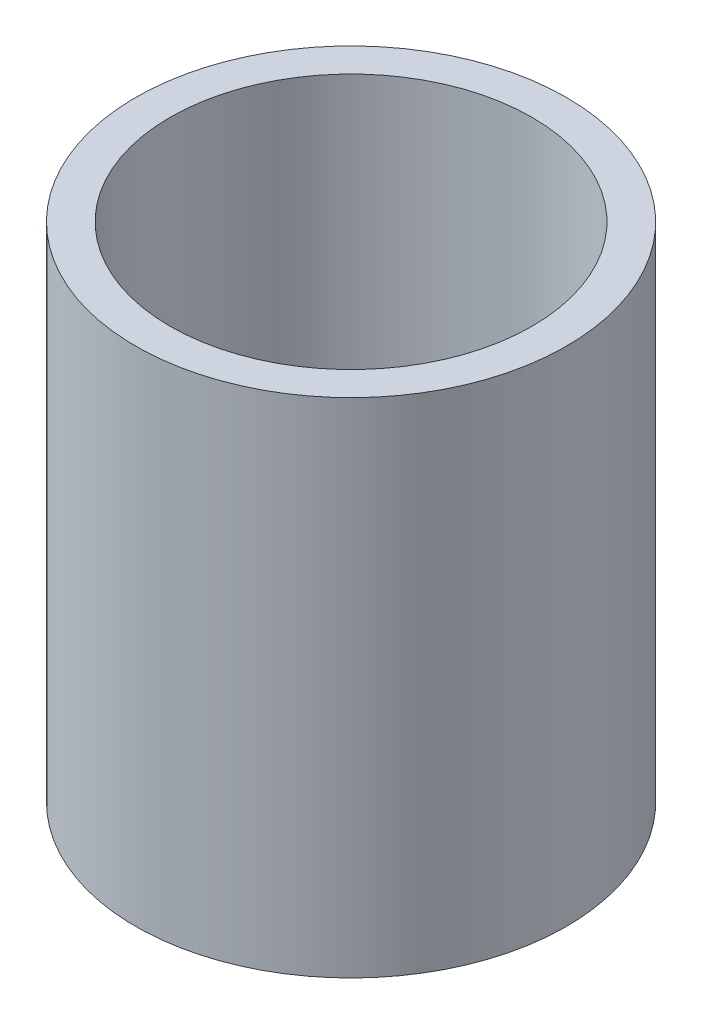
ISO-10303-21;
HEADER;
FILE_DESCRIPTION(('STEP AP214'),'2;1');
FILE_NAME('part.step','',(''),(''),'','','');
FILE_SCHEMA(('AUTOMOTIVE_DESIGN { 1 0 10303 214 1 1 1 1 }'));
ENDSEC;
DATA;
#1=APPLICATION_CONTEXT('core data for automotive mechanical design processes');
#2=APPLICATION_PROTOCOL_DEFINITION('international standard','automotive_design',2000,#1);
#3=PRODUCT_CONTEXT('',#1,'mechanical');
#4=PRODUCT('Part','Part','',(#3));
#5=PRODUCT_RELATED_PRODUCT_CATEGORY('part','',(#4));
#6=PRODUCT_DEFINITION_FORMATION('','',#4);
#7=PRODUCT_DEFINITION_CONTEXT('part definition',#1,'design');
#8=PRODUCT_DEFINITION('design','',#6,#7);
#9=PRODUCT_DEFINITION_SHAPE('','',#8);
#10=(LENGTH_UNIT() NAMED_UNIT(*) SI_UNIT(.MILLI.,.METRE.));
#11=(NAMED_UNIT(*) PLANE_ANGLE_UNIT() SI_UNIT($,.RADIAN.));
#12=(NAMED_UNIT(*) SI_UNIT($,.STERADIAN.) SOLID_ANGLE_UNIT());
#13=UNCERTAINTY_MEASURE_WITH_UNIT(LENGTH_MEASURE(1.E-05),#10,'distance_accuracy_value','');
#14=(GEOMETRIC_REPRESENTATION_CONTEXT(3) GLOBAL_UNCERTAINTY_ASSIGNED_CONTEXT((#13)) GLOBAL_UNIT_ASSIGNED_CONTEXT((#10,
#11,#12)) REPRESENTATION_CONTEXT('',''));
#15=CARTESIAN_POINT('',(0.,0.,0.));
#16=DIRECTION('',(0.,0.,1.));
#17=DIRECTION('',(1.,0.,0.));
#18=AXIS2_PLACEMENT_3D('',#15,#16,#17);
#19=CARTESIAN_POINT('',(0.,84.,0.));
#20=DIRECTION('',(0.,1.,0.));
#21=DIRECTION('',(0.,0.,1.));
#22=AXIS2_PLACEMENT_3D('',#19,#20,#21);
#23=PLANE('',#22);
#24=CARTESIAN_POINT('',(0.,84.,0.));
#25=DIRECTION('',(0.,1.,0.));
#26=DIRECTION('',(0.,0.,1.));
#27=AXIS2_PLACEMENT_3D('',#24,#25,#26);
#28=CIRCLE('',#27,36.);
#29=CARTESIAN_POINT('',(0.,84.,-36.));
#30=VERTEX_POINT('',#29);
#31=EDGE_CURVE('E10',#30,#30,#28,.T.);
#32=ORIENTED_EDGE('',*,*,#31,.T.);
#33=EDGE_LOOP('',(#32));
#34=FACE_BOUND('',#33,.T.);
#35=CARTESIAN_POINT('',(0.,84.,0.));
#36=DIRECTION('',(0.,1.,0.));
#37=DIRECTION('',(0.,0.,1.));
#38=AXIS2_PLACEMENT_3D('',#35,#36,#37);
#39=CIRCLE('',#38,30.25);
#40=CARTESIAN_POINT('',(0.,84.,-30.25));
#41=VERTEX_POINT('',#40);
#42=EDGE_CURVE('E44',#41,#41,#39,.T.);
#43=ORIENTED_EDGE('',*,*,#42,.F.);
#44=EDGE_LOOP('',(#43));
#45=FACE_BOUND('',#44,.T.);
#46=ADVANCED_FACE('F33',(#34,#45),#23,.T.);
#47=CARTESIAN_POINT('',(0.,0.,0.));
#48=DIRECTION('',(0.,1.,0.));
#49=DIRECTION('',(0.,0.,1.));
#50=AXIS2_PLACEMENT_3D('',#47,#48,#49);
#51=PLANE('',#50);
#52=CARTESIAN_POINT('',(0.,0.,0.));
#53=DIRECTION('',(0.,1.,0.));
#54=DIRECTION('',(0.,0.,1.));
#55=AXIS2_PLACEMENT_3D('',#52,#53,#54);
#56=CIRCLE('',#55,36.);
#57=CARTESIAN_POINT('',(0.,0.,-36.));
#58=VERTEX_POINT('',#57);
#59=EDGE_CURVE('E37',#58,#58,#56,.T.);
#60=ORIENTED_EDGE('',*,*,#59,.F.);
#61=EDGE_LOOP('',(#60));
#62=FACE_BOUND('',#61,.T.);
#63=CARTESIAN_POINT('',(0.,0.,0.));
#64=DIRECTION('',(0.,1.,0.));
#65=DIRECTION('',(0.,0.,1.));
#66=AXIS2_PLACEMENT_3D('',#63,#64,#65);
#67=CIRCLE('',#66,30.25);
#68=CARTESIAN_POINT('',(0.,0.,-30.25));
#69=VERTEX_POINT('',#68);
#70=EDGE_CURVE('E46',#69,#69,#67,.T.);
#71=ORIENTED_EDGE('',*,*,#70,.T.);
#72=EDGE_LOOP('',(#71));
#73=FACE_BOUND('',#72,.T.);
#74=ADVANCED_FACE('F56',(#62,#73),#51,.F.);
#75=CARTESIAN_POINT('',(0.,84.,0.));
#76=DIRECTION('',(0.,-1.,0.));
#77=DIRECTION('',(0.,0.,-1.));
#78=AXIS2_PLACEMENT_3D('',#75,#76,#77);
#79=CYLINDRICAL_SURFACE('',#78,36.);
#80=CARTESIAN_POINT('',(0.,84.,-36.));
#81=CARTESIAN_POINT('',(0.,83.125,-36.));
#82=CARTESIAN_POINT('',(0.,82.25,-36.));
#83=CARTESIAN_POINT('',(0.,80.5,-36.));
#84=CARTESIAN_POINT('',(0.,79.625,-36.));
#85=CARTESIAN_POINT('',(0.,77.875,-36.));
#86=CARTESIAN_POINT('',(0.,77.,-36.));
#87=CARTESIAN_POINT('',(0.,75.25,-36.));
#88=CARTESIAN_POINT('',(0.,74.375,-36.));
#89=CARTESIAN_POINT('',(0.,72.625,-36.));
#90=CARTESIAN_POINT('',(0.,71.75,-36.));
#91=CARTESIAN_POINT('',(0.,70.,-36.));
#92=CARTESIAN_POINT('',(0.,69.125,-36.));
#93=CARTESIAN_POINT('',(0.,67.375,-36.));
#94=CARTESIAN_POINT('',(0.,66.5,-36.));
#95=CARTESIAN_POINT('',(0.,64.75,-36.));
#96=CARTESIAN_POINT('',(0.,63.875,-36.));
#97=CARTESIAN_POINT('',(0.,62.125,-36.));
#98=CARTESIAN_POINT('',(0.,61.25,-36.));
#99=CARTESIAN_POINT('',(0.,59.5,-36.));
#100=CARTESIAN_POINT('',(0.,58.625,-36.));
#101=CARTESIAN_POINT('',(0.,56.875,-36.));
#102=CARTESIAN_POINT('',(0.,56.,-36.));
#103=CARTESIAN_POINT('',(0.,54.25,-36.));
#104=CARTESIAN_POINT('',(0.,53.375,-36.));
#105=CARTESIAN_POINT('',(0.,51.625,-36.));
#106=CARTESIAN_POINT('',(0.,50.75,-36.));
#107=CARTESIAN_POINT('',(0.,49.,-36.));
#108=CARTESIAN_POINT('',(0.,48.125,-36.));
#109=CARTESIAN_POINT('',(0.,46.375,-36.));
#110=CARTESIAN_POINT('',(0.,45.5,-36.));
#111=CARTESIAN_POINT('',(0.,43.75,-36.));
#112=CARTESIAN_POINT('',(0.,42.875,-36.));
#113=CARTESIAN_POINT('',(0.,41.125,-36.));
#114=CARTESIAN_POINT('',(0.,40.25,-36.));
#115=CARTESIAN_POINT('',(0.,38.5,-36.));
#116=CARTESIAN_POINT('',(0.,37.625,-36.));
#117=CARTESIAN_POINT('',(0.,35.875,-36.));
#118=CARTESIAN_POINT('',(0.,35.,-36.));
#119=CARTESIAN_POINT('',(0.,33.25,-36.));
#120=CARTESIAN_POINT('',(0.,32.375,-36.));
#121=CARTESIAN_POINT('',(0.,30.625,-36.));
#122=CARTESIAN_POINT('',(0.,29.75,-36.));
#123=CARTESIAN_POINT('',(0.,28.,-36.));
#124=CARTESIAN_POINT('',(0.,27.125,-36.));
#125=CARTESIAN_POINT('',(0.,25.375,-36.));
#126=CARTESIAN_POINT('',(0.,24.5,-36.));
#127=CARTESIAN_POINT('',(0.,22.75,-36.));
#128=CARTESIAN_POINT('',(0.,21.875,-36.));
#129=CARTESIAN_POINT('',(0.,20.125,-36.));
#130=CARTESIAN_POINT('',(0.,19.25,-36.));
#131=CARTESIAN_POINT('',(0.,17.5,-36.));
#132=CARTESIAN_POINT('',(0.,16.625,-36.));
#133=CARTESIAN_POINT('',(0.,14.875,-36.));
#134=CARTESIAN_POINT('',(0.,14.,-36.));
#135=CARTESIAN_POINT('',(0.,12.25,-36.));
#136=CARTESIAN_POINT('',(0.,11.375,-36.));
#137=CARTESIAN_POINT('',(0.,9.625,-36.));
#138=CARTESIAN_POINT('',(0.,8.75,-36.));
#139=CARTESIAN_POINT('',(0.,7.00000000000001,-36.));
#140=CARTESIAN_POINT('',(0.,6.12500000000001,-36.));
#141=CARTESIAN_POINT('',(0.,4.375,-36.));
#142=CARTESIAN_POINT('',(0.,3.5,-36.));
#143=CARTESIAN_POINT('',(0.,1.75,-36.));
#144=CARTESIAN_POINT('',(0.,0.875,-36.));
#145=CARTESIAN_POINT('',(0.,0.,-36.));
#146=B_SPLINE_CURVE_WITH_KNOTS('',3,(#80,#81,#82,#83,#84,#85,#86,#87,#88,#89,#90,#91,#92,#93,
#94,#95,#96,#97,#98,#99,#100,#101,#102,#103,#104,#105,#106,#107,#108,#109,#110,#111,#112,#113,
#114,#115,#116,#117,#118,#119,#120,#121,#122,#123,#124,#125,#126,#127,#128,#129,#130,#131,#132,
#133,#134,#135,#136,#137,#138,#139,#140,#141,#142,#143,#144,#145),.UNSPECIFIED.,.F.,.F.,(4,2,2,
2,2,2,2,2,2,2,2,2,2,2,2,2,2,2,2,2,2,2,2,2,2,2,2,2,2,2,2,2,4),(0.,2.62499999999999,
5.24999999999999,7.87499999999999,10.5,13.125,15.75,18.375,21.,23.625,26.25,28.875,31.5,34.125,
36.75,39.375,42.,44.625,47.25,49.875,52.5,55.125,57.75,60.375,63.,65.625,68.25,70.875,73.5,
76.125,78.75,81.375,84.),.UNSPECIFIED.);
#147=EDGE_CURVE('BSEAM35',#30,#58,#146,.T.);
#148=ORIENTED_EDGE('',*,*,#31,.F.);
#149=ORIENTED_EDGE('',*,*,#59,.T.);
#150=ORIENTED_EDGE('',*,*,#147,.T.);
#151=ORIENTED_EDGE('',*,*,#147,.F.);
#152=EDGE_LOOP('',(#148,#150,#149,#151));
#153=FACE_BOUND('',#152,.T.);
#154=ADVANCED_FACE('F35',(#153),#79,.T.);
#155=CARTESIAN_POINT('',(0.,84.,0.));
#156=DIRECTION('',(0.,-1.,0.));
#157=DIRECTION('',(0.,0.,-1.));
#158=AXIS2_PLACEMENT_3D('',#155,#156,#157);
#159=CYLINDRICAL_SURFACE('',#158,30.25);
#160=CARTESIAN_POINT('',(0.,84.,-30.25));
#161=CARTESIAN_POINT('',(0.,83.125,-30.25));
#162=CARTESIAN_POINT('',(0.,82.25,-30.25));
#163=CARTESIAN_POINT('',(0.,80.5,-30.25));
#164=CARTESIAN_POINT('',(0.,79.625,-30.25));
#165=CARTESIAN_POINT('',(0.,77.875,-30.25));
#166=CARTESIAN_POINT('',(0.,77.,-30.25));
#167=CARTESIAN_POINT('',(0.,75.25,-30.25));
#168=CARTESIAN_POINT('',(0.,74.375,-30.25));
#169=CARTESIAN_POINT('',(0.,72.625,-30.25));
#170=CARTESIAN_POINT('',(0.,71.75,-30.25));
#171=CARTESIAN_POINT('',(0.,70.,-30.25));
#172=CARTESIAN_POINT('',(0.,69.125,-30.25));
#173=CARTESIAN_POINT('',(0.,67.375,-30.25));
#174=CARTESIAN_POINT('',(0.,66.5,-30.25));
#175=CARTESIAN_POINT('',(0.,64.75,-30.25));
#176=CARTESIAN_POINT('',(0.,63.875,-30.25));
#177=CARTESIAN_POINT('',(0.,62.125,-30.25));
#178=CARTESIAN_POINT('',(0.,61.25,-30.25));
#179=CARTESIAN_POINT('',(0.,59.5,-30.25));
#180=CARTESIAN_POINT('',(0.,58.625,-30.25));
#181=CARTESIAN_POINT('',(0.,56.875,-30.25));
#182=CARTESIAN_POINT('',(0.,56.,-30.25));
#183=CARTESIAN_POINT('',(0.,54.25,-30.25));
#184=CARTESIAN_POINT('',(0.,53.375,-30.25));
#185=CARTESIAN_POINT('',(0.,51.625,-30.25));
#186=CARTESIAN_POINT('',(0.,50.75,-30.25));
#187=CARTESIAN_POINT('',(0.,49.,-30.25));
#188=CARTESIAN_POINT('',(0.,48.125,-30.25));
#189=CARTESIAN_POINT('',(0.,46.375,-30.25));
#190=CARTESIAN_POINT('',(0.,45.5,-30.25));
#191=CARTESIAN_POINT('',(0.,43.75,-30.25));
#192=CARTESIAN_POINT('',(0.,42.875,-30.25));
#193=CARTESIAN_POINT('',(0.,41.125,-30.25));
#194=CARTESIAN_POINT('',(0.,40.25,-30.25));
#195=CARTESIAN_POINT('',(0.,38.5,-30.25));
#196=CARTESIAN_POINT('',(0.,37.625,-30.25));
#197=CARTESIAN_POINT('',(0.,35.875,-30.25));
#198=CARTESIAN_POINT('',(0.,35.,-30.25));
#199=CARTESIAN_POINT('',(0.,33.25,-30.25));
#200=CARTESIAN_POINT('',(0.,32.375,-30.25));
#201=CARTESIAN_POINT('',(0.,30.625,-30.25));
#202=CARTESIAN_POINT('',(0.,29.75,-30.25));
#203=CARTESIAN_POINT('',(0.,28.,-30.25));
#204=CARTESIAN_POINT('',(0.,27.125,-30.25));
#205=CARTESIAN_POINT('',(0.,25.375,-30.25));
#206=CARTESIAN_POINT('',(0.,24.5,-30.25));
#207=CARTESIAN_POINT('',(0.,22.75,-30.25));
#208=CARTESIAN_POINT('',(0.,21.875,-30.25));
#209=CARTESIAN_POINT('',(0.,20.125,-30.25));
#210=CARTESIAN_POINT('',(0.,19.25,-30.25));
#211=CARTESIAN_POINT('',(0.,17.5,-30.25));
#212=CARTESIAN_POINT('',(0.,16.625,-30.25));
#213=CARTESIAN_POINT('',(0.,14.875,-30.25));
#214=CARTESIAN_POINT('',(0.,14.,-30.25));
#215=CARTESIAN_POINT('',(0.,12.25,-30.25));
#216=CARTESIAN_POINT('',(0.,11.375,-30.25));
#217=CARTESIAN_POINT('',(0.,9.625,-30.25));
#218=CARTESIAN_POINT('',(0.,8.75,-30.25));
#219=CARTESIAN_POINT('',(0.,7.00000000000001,-30.25));
#220=CARTESIAN_POINT('',(0.,6.12500000000001,-30.25));
#221=CARTESIAN_POINT('',(0.,4.375,-30.25));
#222=CARTESIAN_POINT('',(0.,3.5,-30.25));
#223=CARTESIAN_POINT('',(0.,1.75,-30.25));
#224=CARTESIAN_POINT('',(0.,0.875,-30.25));
#225=CARTESIAN_POINT('',(0.,0.,-30.25));
#226=B_SPLINE_CURVE_WITH_KNOTS('',3,(#160,#161,#162,#163,#164,#165,#166,#167,#168,#169,#170,
#171,#172,#173,#174,#175,#176,#177,#178,#179,#180,#181,#182,#183,#184,#185,#186,#187,#188,#189,
#190,#191,#192,#193,#194,#195,#196,#197,#198,#199,#200,#201,#202,#203,#204,#205,#206,#207,#208,
#209,#210,#211,#212,#213,#214,#215,#216,#217,#218,#219,#220,#221,#222,#223,#224,#225),
.UNSPECIFIED.,.F.,.F.,(4,2,2,2,2,2,2,2,2,2,2,2,2,2,2,2,2,2,2,2,2,2,2,2,2,2,2,2,2,2,2,2,4),(0.,
2.62499999999999,5.24999999999999,7.87499999999999,10.5,13.125,15.75,18.375,21.,23.625,26.25,
28.875,31.5,34.125,36.75,39.375,42.,44.625,47.25,49.875,52.5,55.125,57.75,60.375,63.,65.625,
68.25,70.875,73.5,76.125,78.75,81.375,84.),.UNSPECIFIED.);
#227=EDGE_CURVE('BSEAM52',#41,#69,#226,.T.);
#228=ORIENTED_EDGE('',*,*,#42,.T.);
#229=ORIENTED_EDGE('',*,*,#70,.F.);
#230=ORIENTED_EDGE('',*,*,#227,.T.);
#231=ORIENTED_EDGE('',*,*,#227,.F.);
#232=EDGE_LOOP('',(#228,#230,#229,#231));
#233=FACE_BOUND('',#232,.T.);
#234=ADVANCED_FACE('F52',(#233),#159,.F.);
#235=CLOSED_SHELL('',(#46,#74,#154,#234));
#236=MANIFOLD_SOLID_BREP('B2',#235);
#237=ADVANCED_BREP_SHAPE_REPRESENTATION('',(#18,#236),#14);
#238=SHAPE_DEFINITION_REPRESENTATION(#9,#237);
ENDSEC;
END-ISO-10303-21;
